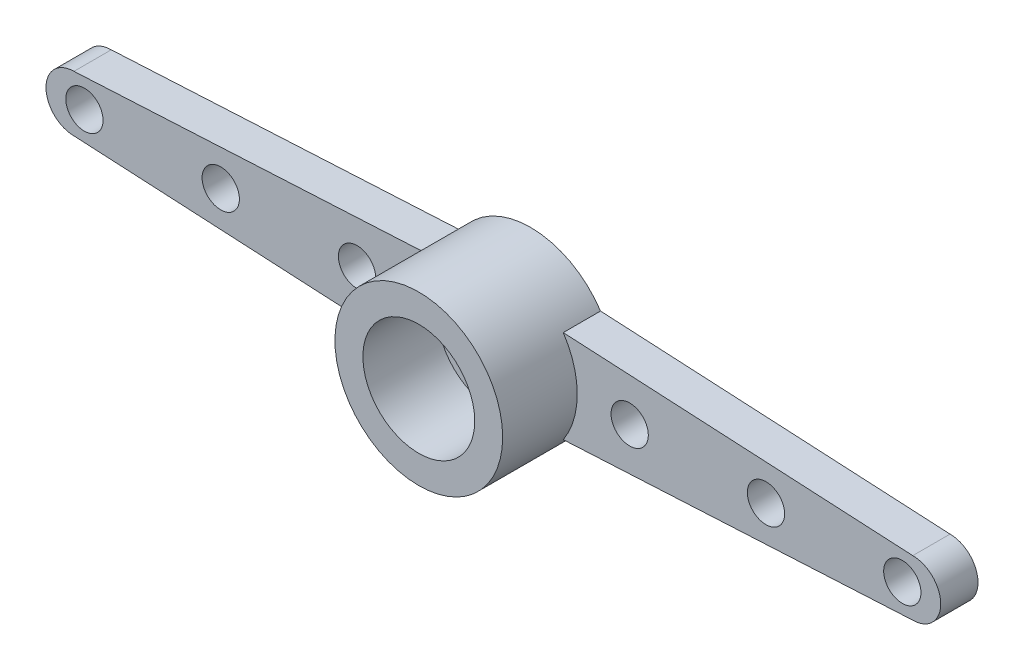
ISO-10303-21;
HEADER;
FILE_DESCRIPTION(('STEP AP214'),'2;1');
FILE_NAME('part.step','',(''),(''),'','','');
FILE_SCHEMA(('AUTOMOTIVE_DESIGN { 1 0 10303 214 1 1 1 1 }'));
ENDSEC;
DATA;
#1=APPLICATION_CONTEXT('core data for automotive mechanical design processes');
#2=APPLICATION_PROTOCOL_DEFINITION('international standard','automotive_design',2000,#1);
#3=PRODUCT_CONTEXT('',#1,'mechanical');
#4=PRODUCT('Part','Part','',(#3));
#5=PRODUCT_RELATED_PRODUCT_CATEGORY('part','',(#4));
#6=PRODUCT_DEFINITION_FORMATION('','',#4);
#7=PRODUCT_DEFINITION_CONTEXT('part definition',#1,'design');
#8=PRODUCT_DEFINITION('design','',#6,#7);
#9=PRODUCT_DEFINITION_SHAPE('','',#8);
#10=(LENGTH_UNIT() NAMED_UNIT(*) SI_UNIT(.MILLI.,.METRE.));
#11=(NAMED_UNIT(*) PLANE_ANGLE_UNIT() SI_UNIT($,.RADIAN.));
#12=(NAMED_UNIT(*) SI_UNIT($,.STERADIAN.) SOLID_ANGLE_UNIT());
#13=UNCERTAINTY_MEASURE_WITH_UNIT(LENGTH_MEASURE(1.E-05),#10,'distance_accuracy_value','');
#14=(GEOMETRIC_REPRESENTATION_CONTEXT(3) GLOBAL_UNCERTAINTY_ASSIGNED_CONTEXT((#13)) GLOBAL_UNIT_ASSIGNED_CONTEXT((#10,
#11,#12)) REPRESENTATION_CONTEXT('',''));
#15=CARTESIAN_POINT('',(0.,0.,0.));
#16=DIRECTION('',(0.,0.,1.));
#17=DIRECTION('',(1.,0.,0.));
#18=AXIS2_PLACEMENT_3D('',#15,#16,#17);
#19=CARTESIAN_POINT('',(-22.5,0.,6.));
#20=DIRECTION('',(0.,0.,-1.));
#21=DIRECTION('',(-1.,0.,0.));
#22=AXIS2_PLACEMENT_3D('',#19,#20,#21);
#23=CYLINDRICAL_SURFACE('',#22,1.5);
#24=CARTESIAN_POINT('',(-22.5,0.,2.));
#25=DIRECTION('',(0.,0.,1.));
#26=DIRECTION('',(1.,0.,0.));
#27=AXIS2_PLACEMENT_3D('',#24,#25,#26);
#28=CIRCLE('',#27,1.5);
#29=CARTESIAN_POINT('',(-22.5,1.5,2.));
#30=VERTEX_POINT('',#29);
#31=CARTESIAN_POINT('',(-22.5,-1.5,2.));
#32=VERTEX_POINT('',#31);
#33=EDGE_CURVE('E115',#30,#32,#28,.T.);
#34=ORIENTED_EDGE('',*,*,#33,.F.);
#35=DIRECTION('',(0.,0.,-1.));
#36=VECTOR('',#35,1.);
#37=CARTESIAN_POINT('',(-22.5,1.5,6.));
#38=LINE('',#37,#36);
#39=CARTESIAN_POINT('',(-22.5,1.5,0.));
#40=VERTEX_POINT('',#39);
#41=EDGE_CURVE('E53',#30,#40,#38,.T.);
#42=ORIENTED_EDGE('',*,*,#41,.T.);
#43=CARTESIAN_POINT('',(-22.5,0.,0.));
#44=DIRECTION('',(0.,0.,1.));
#45=DIRECTION('',(1.,0.,0.));
#46=AXIS2_PLACEMENT_3D('',#43,#44,#45);
#47=CIRCLE('',#46,1.5);
#48=CARTESIAN_POINT('',(-22.5,-1.5,0.));
#49=VERTEX_POINT('',#48);
#50=EDGE_CURVE('E173',#40,#49,#47,.T.);
#51=ORIENTED_EDGE('',*,*,#50,.T.);
#52=DIRECTION('',(0.,0.,-1.));
#53=VECTOR('',#52,1.);
#54=CARTESIAN_POINT('',(-22.5,-1.5,6.));
#55=LINE('',#54,#53);
#56=EDGE_CURVE('E11',#32,#49,#55,.T.);
#57=ORIENTED_EDGE('',*,*,#56,.F.);
#58=EDGE_LOOP('',(#34,#42,#51,#57));
#59=FACE_BOUND('',#58,.T.);
#60=ADVANCED_FACE('F37',(#59),#23,.T.);
#61=CARTESIAN_POINT('',(-0.141012405413293,-2.67753589417127,6.));
#62=DIRECTION('',(0.0525921073474452,0.998616077501637,0.));
#63=DIRECTION('',(-0.998616077501637,0.0525921073474452,0.));
#64=AXIS2_PLACEMENT_3D('',#61,#62,#63);
#65=PLANE('',#64);
#66=DIRECTION('',(0.998616077501637,-0.0525921073474452,0.));
#67=VECTOR('',#66,1.);
#68=CARTESIAN_POINT('',(-0.141012405413293,-2.67753589417127,2.));
#69=LINE('',#68,#67);
#70=CARTESIAN_POINT('',(-3.75,-2.48746859276655,2.));
#71=VERTEX_POINT('',#70);
#72=EDGE_CURVE('E109',#32,#71,#69,.T.);
#73=ORIENTED_EDGE('',*,*,#72,.F.);
#74=ORIENTED_EDGE('',*,*,#56,.T.);
#75=DIRECTION('',(0.998616077501637,-0.0525921073474452,0.));
#76=VECTOR('',#75,1.);
#77=CARTESIAN_POINT('',(-0.141012405413293,-2.67753589417127,0.));
#78=LINE('',#77,#76);
#79=CARTESIAN_POINT('',(-3.75000000000001,-2.48746859276655,0.));
#80=VERTEX_POINT('',#79);
#81=EDGE_CURVE('E191',#49,#80,#78,.T.);
#82=ORIENTED_EDGE('',*,*,#81,.T.);
#83=DIRECTION('',(0.,0.,-1.));
#84=VECTOR('',#83,1.);
#85=CARTESIAN_POINT('',(-3.75000000000001,-2.48746859276655,6.));
#86=LINE('',#85,#84);
#87=EDGE_CURVE('E45',#71,#80,#86,.T.);
#88=ORIENTED_EDGE('',*,*,#87,.F.);
#89=EDGE_LOOP('',(#73,#74,#82,#88));
#90=FACE_BOUND('',#89,.T.);
#91=ADVANCED_FACE('F212',(#90),#65,.F.);
#92=CARTESIAN_POINT('',(0.141012405413293,-2.67753589417127,6.));
#93=DIRECTION('',(0.0525921073474452,-0.998616077501637,0.));
#94=DIRECTION('',(0.998616077501637,0.0525921073474452,0.));
#95=AXIS2_PLACEMENT_3D('',#92,#93,#94);
#96=PLANE('',#95);
#97=DIRECTION('',(0.,0.,-1.));
#98=VECTOR('',#97,1.);
#99=CARTESIAN_POINT('',(22.5,-1.5,6.));
#100=LINE('',#99,#98);
#101=CARTESIAN_POINT('',(22.5,-1.5,2.));
#102=VERTEX_POINT('',#101);
#103=CARTESIAN_POINT('',(22.5,-1.5,0.));
#104=VERTEX_POINT('',#103);
#105=EDGE_CURVE('E131',#102,#104,#100,.T.);
#106=ORIENTED_EDGE('',*,*,#105,.F.);
#107=DIRECTION('',(0.998616077501637,0.0525921073474452,0.));
#108=VECTOR('',#107,1.);
#109=CARTESIAN_POINT('',(0.141012405413293,-2.67753589417127,2.));
#110=LINE('',#109,#108);
#111=CARTESIAN_POINT('',(3.74999999999999,-2.48746859276655,2.));
#112=VERTEX_POINT('',#111);
#113=EDGE_CURVE('E176',#112,#102,#110,.T.);
#114=ORIENTED_EDGE('',*,*,#113,.F.);
#115=DIRECTION('',(0.,0.,-1.));
#116=VECTOR('',#115,1.);
#117=CARTESIAN_POINT('',(3.74999999999999,-2.48746859276656,6.));
#118=LINE('',#117,#116);
#119=CARTESIAN_POINT('',(3.74999999999999,-2.48746859276656,0.));
#120=VERTEX_POINT('',#119);
#121=EDGE_CURVE('E133',#112,#120,#118,.T.);
#122=ORIENTED_EDGE('',*,*,#121,.T.);
#123=DIRECTION('',(-0.998616077501637,-0.0525921073474452,0.));
#124=VECTOR('',#123,1.);
#125=CARTESIAN_POINT('',(0.141012405413293,-2.67753589417127,0.));
#126=LINE('',#125,#124);
#127=EDGE_CURVE('E197',#104,#120,#126,.T.);
#128=ORIENTED_EDGE('',*,*,#127,.F.);
#129=EDGE_LOOP('',(#106,#114,#122,#128));
#130=FACE_BOUND('',#129,.T.);
#131=ADVANCED_FACE('F218',(#130),#96,.T.);
#132=CARTESIAN_POINT('',(22.5,0.,6.));
#133=DIRECTION('',(0.,0.,-1.));
#134=DIRECTION('',(-1.,0.,0.));
#135=AXIS2_PLACEMENT_3D('',#132,#133,#134);
#136=CYLINDRICAL_SURFACE('',#135,1.5);
#137=CARTESIAN_POINT('',(22.5,0.,2.));
#138=DIRECTION('',(0.,0.,1.));
#139=DIRECTION('',(1.,0.,0.));
#140=AXIS2_PLACEMENT_3D('',#137,#138,#139);
#141=CIRCLE('',#140,1.5);
#142=CARTESIAN_POINT('',(22.5,1.5,2.));
#143=VERTEX_POINT('',#142);
#144=EDGE_CURVE('E179',#102,#143,#141,.T.);
#145=ORIENTED_EDGE('',*,*,#144,.F.);
#146=ORIENTED_EDGE('',*,*,#105,.T.);
#147=CARTESIAN_POINT('',(22.5,0.,0.));
#148=DIRECTION('',(0.,0.,1.));
#149=DIRECTION('',(1.,0.,0.));
#150=AXIS2_PLACEMENT_3D('',#147,#148,#149);
#151=CIRCLE('',#150,1.5);
#152=CARTESIAN_POINT('',(22.5,1.5,0.));
#153=VERTEX_POINT('',#152);
#154=EDGE_CURVE('E200',#104,#153,#151,.T.);
#155=ORIENTED_EDGE('',*,*,#154,.T.);
#156=DIRECTION('',(0.,0.,-1.));
#157=VECTOR('',#156,1.);
#158=CARTESIAN_POINT('',(22.5,1.5,6.));
#159=LINE('',#158,#157);
#160=EDGE_CURVE('E124',#143,#153,#159,.T.);
#161=ORIENTED_EDGE('',*,*,#160,.F.);
#162=EDGE_LOOP('',(#145,#146,#155,#161));
#163=FACE_BOUND('',#162,.T.);
#164=ADVANCED_FACE('F226',(#163),#136,.T.);
#165=CARTESIAN_POINT('',(0.141012405413293,2.67753589417127,6.));
#166=DIRECTION('',(-0.0525921073474452,-0.998616077501637,0.));
#167=DIRECTION('',(0.998616077501637,-0.0525921073474452,0.));
#168=AXIS2_PLACEMENT_3D('',#165,#166,#167);
#169=PLANE('',#168);
#170=DIRECTION('',(-0.998616077501637,0.0525921073474452,0.));
#171=VECTOR('',#170,1.);
#172=CARTESIAN_POINT('',(0.141012405413293,2.67753589417127,2.));
#173=LINE('',#172,#171);
#174=CARTESIAN_POINT('',(3.75,2.48746859276655,2.));
#175=VERTEX_POINT('',#174);
#176=EDGE_CURVE('E112',#143,#175,#173,.T.);
#177=ORIENTED_EDGE('',*,*,#176,.F.);
#178=ORIENTED_EDGE('',*,*,#160,.T.);
#179=DIRECTION('',(-0.998616077501637,0.0525921073474452,0.));
#180=VECTOR('',#179,1.);
#181=CARTESIAN_POINT('',(0.141012405413293,2.67753589417127,0.));
#182=LINE('',#181,#180);
#183=CARTESIAN_POINT('',(3.75,2.48746859276655,0.));
#184=VERTEX_POINT('',#183);
#185=EDGE_CURVE('E203',#153,#184,#182,.T.);
#186=ORIENTED_EDGE('',*,*,#185,.T.);
#187=DIRECTION('',(0.,0.,-1.));
#188=VECTOR('',#187,1.);
#189=CARTESIAN_POINT('',(3.75,2.48746859276655,6.));
#190=LINE('',#189,#188);
#191=EDGE_CURVE('E122',#175,#184,#190,.T.);
#192=ORIENTED_EDGE('',*,*,#191,.F.);
#193=EDGE_LOOP('',(#177,#178,#186,#192));
#194=FACE_BOUND('',#193,.T.);
#195=ADVANCED_FACE('F228',(#194),#169,.F.);
#196=CARTESIAN_POINT('',(-0.141012405413293,2.67753589417127,6.));
#197=DIRECTION('',(-0.0525921073474452,0.998616077501637,0.));
#198=DIRECTION('',(-0.998616077501637,-0.0525921073474452,0.));
#199=AXIS2_PLACEMENT_3D('',#196,#197,#198);
#200=PLANE('',#199);
#201=ORIENTED_EDGE('',*,*,#41,.F.);
#202=DIRECTION('',(-0.998616077501637,-0.0525921073474452,0.));
#203=VECTOR('',#202,1.);
#204=CARTESIAN_POINT('',(-0.141012405413293,2.67753589417127,2.));
#205=LINE('',#204,#203);
#206=CARTESIAN_POINT('',(-3.75,2.48746859276655,2.));
#207=VERTEX_POINT('',#206);
#208=EDGE_CURVE('E107',#207,#30,#205,.T.);
#209=ORIENTED_EDGE('',*,*,#208,.F.);
#210=DIRECTION('',(0.,0.,-1.));
#211=VECTOR('',#210,1.);
#212=CARTESIAN_POINT('',(-3.75,2.48746859276656,6.));
#213=LINE('',#212,#211);
#214=CARTESIAN_POINT('',(-3.75,2.48746859276656,0.));
#215=VERTEX_POINT('',#214);
#216=EDGE_CURVE('E61',#207,#215,#213,.T.);
#217=ORIENTED_EDGE('',*,*,#216,.T.);
#218=DIRECTION('',(0.998616077501637,0.0525921073474452,0.));
#219=VECTOR('',#218,1.);
#220=CARTESIAN_POINT('',(-0.141012405413293,2.67753589417127,0.));
#221=LINE('',#220,#219);
#222=EDGE_CURVE('E189',#40,#215,#221,.T.);
#223=ORIENTED_EDGE('',*,*,#222,.F.);
#224=EDGE_LOOP('',(#201,#209,#217,#223));
#225=FACE_BOUND('',#224,.T.);
#226=ADVANCED_FACE('F114',(#225),#200,.T.);
#227=CARTESIAN_POINT('',(0.,0.,6.));
#228=DIRECTION('',(0.,0.,1.));
#229=DIRECTION('',(1.,0.,0.));
#230=AXIS2_PLACEMENT_3D('',#227,#228,#229);
#231=PLANE('',#230);
#232=CARTESIAN_POINT('',(0.,0.,6.));
#233=DIRECTION('',(0.,0.,1.));
#234=DIRECTION('',(1.,0.,0.));
#235=AXIS2_PLACEMENT_3D('',#232,#233,#234);
#236=CIRCLE('',#235,3.);
#237=CARTESIAN_POINT('',(3.,0.,6.));
#238=VERTEX_POINT('',#237);
#239=EDGE_CURVE('E149',#238,#238,#236,.T.);
#240=ORIENTED_EDGE('',*,*,#239,.F.);
#241=EDGE_LOOP('',(#240));
#242=FACE_BOUND('',#241,.T.);
#243=CARTESIAN_POINT('',(0.,0.,6.));
#244=DIRECTION('',(0.,0.,1.));
#245=DIRECTION('',(1.,0.,0.));
#246=AXIS2_PLACEMENT_3D('',#243,#244,#245);
#247=CIRCLE('',#246,4.5);
#248=CARTESIAN_POINT('',(4.5,0.,6.));
#249=VERTEX_POINT('',#248);
#250=EDGE_CURVE('E126',#249,#249,#247,.T.);
#251=ORIENTED_EDGE('',*,*,#250,.T.);
#252=EDGE_LOOP('',(#251));
#253=FACE_BOUND('',#252,.T.);
#254=ADVANCED_FACE('F236',(#242,#253),#231,.T.);
#255=CARTESIAN_POINT('',(0.,0.,6.));
#256=DIRECTION('',(0.,0.,-1.));
#257=DIRECTION('',(-1.,0.,0.));
#258=AXIS2_PLACEMENT_3D('',#255,#256,#257);
#259=CYLINDRICAL_SURFACE('',#258,4.5);
#260=CARTESIAN_POINT('',(0.,0.,2.));
#261=DIRECTION('',(0.,0.,1.));
#262=DIRECTION('',(1.,0.,0.));
#263=AXIS2_PLACEMENT_3D('',#260,#261,#262);
#264=CIRCLE('',#263,4.5);
#265=EDGE_CURVE('E105',#207,#71,#264,.T.);
#266=ORIENTED_EDGE('',*,*,#265,.T.);
#267=ORIENTED_EDGE('',*,*,#87,.T.);
#268=CARTESIAN_POINT('',(0.,0.,0.));
#269=DIRECTION('',(0.,0.,1.));
#270=DIRECTION('',(1.,0.,0.));
#271=AXIS2_PLACEMENT_3D('',#268,#269,#270);
#272=CIRCLE('',#271,4.5);
#273=EDGE_CURVE('E194',#80,#120,#272,.T.);
#274=ORIENTED_EDGE('',*,*,#273,.T.);
#275=ORIENTED_EDGE('',*,*,#121,.F.);
#276=CARTESIAN_POINT('',(0.,0.,2.));
#277=DIRECTION('',(0.,0.,1.));
#278=DIRECTION('',(1.,0.,0.));
#279=AXIS2_PLACEMENT_3D('',#276,#277,#278);
#280=CIRCLE('',#279,4.5);
#281=EDGE_CURVE('E174',#112,#175,#280,.T.);
#282=ORIENTED_EDGE('',*,*,#281,.T.);
#283=ORIENTED_EDGE('',*,*,#191,.T.);
#284=EDGE_CURVE('E120',#184,#215,#272,.T.);
#285=ORIENTED_EDGE('',*,*,#284,.T.);
#286=ORIENTED_EDGE('',*,*,#216,.F.);
#287=EDGE_LOOP('',(#266,#267,#274,#275,#282,#283,#285,#286));
#288=FACE_BOUND('',#287,.T.);
#289=ORIENTED_EDGE('',*,*,#250,.F.);
#290=EDGE_LOOP('',(#289));
#291=FACE_BOUND('',#290,.T.);
#292=ADVANCED_FACE('F117',(#288,#291),#259,.T.);
#293=CARTESIAN_POINT('',(0.,0.,0.));
#294=DIRECTION('',(0.,0.,1.));
#295=DIRECTION('',(1.,0.,0.));
#296=AXIS2_PLACEMENT_3D('',#293,#294,#295);
#297=PLANE('',#296);
#298=CARTESIAN_POINT('',(7.31290224841313,0.,0.));
#299=DIRECTION('',(0.,0.,1.));
#300=DIRECTION('',(1.,0.,0.));
#301=AXIS2_PLACEMENT_3D('',#298,#299,#300);
#302=CIRCLE('',#301,1.);
#303=CARTESIAN_POINT('',(8.31290224841313,0.,0.));
#304=VERTEX_POINT('',#303);
#305=EDGE_CURVE('E153',#304,#304,#302,.T.);
#306=ORIENTED_EDGE('',*,*,#305,.T.);
#307=EDGE_LOOP('',(#306));
#308=FACE_BOUND('',#307,.T.);
#309=CARTESIAN_POINT('',(14.6258044968263,0.,0.));
#310=DIRECTION('',(0.,0.,1.));
#311=DIRECTION('',(1.,0.,0.));
#312=AXIS2_PLACEMENT_3D('',#309,#310,#311);
#313=CIRCLE('',#312,1.);
#314=CARTESIAN_POINT('',(15.6258044968263,0.,0.));
#315=VERTEX_POINT('',#314);
#316=EDGE_CURVE('E407',#315,#315,#313,.T.);
#317=ORIENTED_EDGE('',*,*,#316,.T.);
#318=EDGE_LOOP('',(#317));
#319=FACE_BOUND('',#318,.T.);
#320=CARTESIAN_POINT('',(21.9387067452394,0.,0.));
#321=DIRECTION('',(0.,0.,1.));
#322=DIRECTION('',(1.,0.,0.));
#323=AXIS2_PLACEMENT_3D('',#320,#321,#322);
#324=CIRCLE('',#323,1.);
#325=CARTESIAN_POINT('',(22.9387067452394,0.,0.));
#326=VERTEX_POINT('',#325);
#327=EDGE_CURVE('E410',#326,#326,#324,.T.);
#328=ORIENTED_EDGE('',*,*,#327,.T.);
#329=EDGE_LOOP('',(#328));
#330=FACE_BOUND('',#329,.T.);
#331=CARTESIAN_POINT('',(0.,0.,0.));
#332=DIRECTION('',(0.,0.,-1.));
#333=DIRECTION('',(-1.,0.,0.));
#334=AXIS2_PLACEMENT_3D('',#331,#332,#333);
#335=CIRCLE('',#334,1.);
#336=CARTESIAN_POINT('',(-1.,0.,0.));
#337=VERTEX_POINT('',#336);
#338=EDGE_CURVE('E140',#337,#337,#335,.T.);
#339=ORIENTED_EDGE('',*,*,#338,.F.);
#340=EDGE_LOOP('',(#339));
#341=FACE_BOUND('',#340,.T.);
#342=CARTESIAN_POINT('',(-7.31290224841313,0.,0.));
#343=DIRECTION('',(0.,0.,-1.));
#344=DIRECTION('',(-1.,0.,0.));
#345=AXIS2_PLACEMENT_3D('',#342,#343,#344);
#346=CIRCLE('',#345,1.);
#347=CARTESIAN_POINT('',(-8.31290224841313,0.,0.));
#348=VERTEX_POINT('',#347);
#349=EDGE_CURVE('E167',#348,#348,#346,.T.);
#350=ORIENTED_EDGE('',*,*,#349,.F.);
#351=EDGE_LOOP('',(#350));
#352=FACE_BOUND('',#351,.T.);
#353=CARTESIAN_POINT('',(-14.6258044968263,0.,0.));
#354=DIRECTION('',(0.,0.,-1.));
#355=DIRECTION('',(-1.,0.,0.));
#356=AXIS2_PLACEMENT_3D('',#353,#354,#355);
#357=CIRCLE('',#356,1.);
#358=CARTESIAN_POINT('',(-15.6258044968263,0.,0.));
#359=VERTEX_POINT('',#358);
#360=EDGE_CURVE('E162',#359,#359,#357,.T.);
#361=ORIENTED_EDGE('',*,*,#360,.F.);
#362=EDGE_LOOP('',(#361));
#363=FACE_BOUND('',#362,.T.);
#364=CARTESIAN_POINT('',(-21.9387067452394,0.,0.));
#365=DIRECTION('',(0.,0.,-1.));
#366=DIRECTION('',(-1.,0.,0.));
#367=AXIS2_PLACEMENT_3D('',#364,#365,#366);
#368=CIRCLE('',#367,1.);
#369=CARTESIAN_POINT('',(-22.9387067452394,0.,0.));
#370=VERTEX_POINT('',#369);
#371=EDGE_CURVE('E158',#370,#370,#368,.T.);
#372=ORIENTED_EDGE('',*,*,#371,.F.);
#373=EDGE_LOOP('',(#372));
#374=FACE_BOUND('',#373,.T.);
#375=ORIENTED_EDGE('',*,*,#50,.F.);
#376=ORIENTED_EDGE('',*,*,#222,.T.);
#377=ORIENTED_EDGE('',*,*,#284,.F.);
#378=ORIENTED_EDGE('',*,*,#185,.F.);
#379=ORIENTED_EDGE('',*,*,#154,.F.);
#380=ORIENTED_EDGE('',*,*,#127,.T.);
#381=ORIENTED_EDGE('',*,*,#273,.F.);
#382=ORIENTED_EDGE('',*,*,#81,.F.);
#383=EDGE_LOOP('',(#375,#376,#377,#378,#379,#380,#381,#382));
#384=FACE_BOUND('',#383,.T.);
#385=ADVANCED_FACE('F206',(#308,#319,#330,#341,#352,#363,#374,#384),#297,.F.);
#386=CARTESIAN_POINT('',(0.,0.,2.));
#387=DIRECTION('',(0.,0.,1.));
#388=DIRECTION('',(1.,0.,0.));
#389=AXIS2_PLACEMENT_3D('',#386,#387,#388);
#390=CYLINDRICAL_SURFACE('',#389,3.);
#391=CARTESIAN_POINT('',(0.,0.,2.));
#392=DIRECTION('',(0.,0.,1.));
#393=DIRECTION('',(1.,0.,0.));
#394=AXIS2_PLACEMENT_3D('',#391,#392,#393);
#395=CIRCLE('',#394,3.);
#396=CARTESIAN_POINT('',(3.,0.,2.));
#397=VERTEX_POINT('',#396);
#398=EDGE_CURVE('E177',#397,#397,#395,.T.);
#399=ORIENTED_EDGE('',*,*,#398,.F.);
#400=EDGE_LOOP('',(#399));
#401=FACE_BOUND('',#400,.T.);
#402=ORIENTED_EDGE('',*,*,#239,.T.);
#403=EDGE_LOOP('',(#402));
#404=FACE_BOUND('',#403,.T.);
#405=ADVANCED_FACE('F289',(#401,#404),#390,.F.);
#406=CARTESIAN_POINT('',(0.,0.,2.));
#407=DIRECTION('',(0.,0.,1.));
#408=DIRECTION('',(1.,0.,0.));
#409=AXIS2_PLACEMENT_3D('',#406,#407,#408);
#410=PLANE('',#409);
#411=CARTESIAN_POINT('',(0.,0.,2.));
#412=DIRECTION('',(0.,0.,1.));
#413=DIRECTION('',(1.,0.,0.));
#414=AXIS2_PLACEMENT_3D('',#411,#412,#413);
#415=CIRCLE('',#414,1.);
#416=CARTESIAN_POINT('',(1.,0.,2.));
#417=VERTEX_POINT('',#416);
#418=EDGE_CURVE('E146',#417,#417,#415,.T.);
#419=ORIENTED_EDGE('',*,*,#418,.F.);
#420=EDGE_LOOP('',(#419));
#421=FACE_BOUND('',#420,.T.);
#422=ORIENTED_EDGE('',*,*,#398,.T.);
#423=EDGE_LOOP('',(#422));
#424=FACE_BOUND('',#423,.T.);
#425=ADVANCED_FACE('F293',(#421,#424),#410,.T.);
#426=CARTESIAN_POINT('',(0.,0.,2.));
#427=DIRECTION('',(0.,0.,1.));
#428=DIRECTION('',(1.,0.,0.));
#429=AXIS2_PLACEMENT_3D('',#426,#427,#428);
#430=PLANE('',#429);
#431=CARTESIAN_POINT('',(7.31290224841313,0.,2.));
#432=DIRECTION('',(0.,0.,1.));
#433=DIRECTION('',(1.,0.,0.));
#434=AXIS2_PLACEMENT_3D('',#431,#432,#433);
#435=CIRCLE('',#434,1.);
#436=CARTESIAN_POINT('',(8.31290224841313,0.,2.));
#437=VERTEX_POINT('',#436);
#438=EDGE_CURVE('E40',#437,#437,#435,.F.);
#439=ORIENTED_EDGE('',*,*,#438,.T.);
#440=EDGE_LOOP('',(#439));
#441=FACE_BOUND('',#440,.T.);
#442=CARTESIAN_POINT('',(14.6258044968263,0.,2.));
#443=DIRECTION('',(0.,0.,1.));
#444=DIRECTION('',(1.,0.,0.));
#445=AXIS2_PLACEMENT_3D('',#442,#443,#444);
#446=CIRCLE('',#445,1.);
#447=CARTESIAN_POINT('',(15.6258044968263,0.,2.));
#448=VERTEX_POINT('',#447);
#449=EDGE_CURVE('E152',#448,#448,#446,.F.);
#450=ORIENTED_EDGE('',*,*,#449,.T.);
#451=EDGE_LOOP('',(#450));
#452=FACE_BOUND('',#451,.T.);
#453=CARTESIAN_POINT('',(21.9387067452394,0.,2.));
#454=DIRECTION('',(0.,0.,1.));
#455=DIRECTION('',(1.,0.,0.));
#456=AXIS2_PLACEMENT_3D('',#453,#454,#455);
#457=CIRCLE('',#456,1.);
#458=CARTESIAN_POINT('',(22.9387067452394,0.,2.));
#459=VERTEX_POINT('',#458);
#460=EDGE_CURVE('E150',#459,#459,#457,.F.);
#461=ORIENTED_EDGE('',*,*,#460,.T.);
#462=EDGE_LOOP('',(#461));
#463=FACE_BOUND('',#462,.T.);
#464=ORIENTED_EDGE('',*,*,#281,.F.);
#465=ORIENTED_EDGE('',*,*,#113,.T.);
#466=ORIENTED_EDGE('',*,*,#144,.T.);
#467=ORIENTED_EDGE('',*,*,#176,.T.);
#468=EDGE_LOOP('',(#464,#465,#466,#467));
#469=FACE_BOUND('',#468,.T.);
#470=ADVANCED_FACE('F222',(#441,#452,#463,#469),#430,.T.);
#471=CARTESIAN_POINT('',(0.,0.,2.));
#472=DIRECTION('',(0.,0.,1.));
#473=DIRECTION('',(1.,0.,0.));
#474=AXIS2_PLACEMENT_3D('',#471,#472,#473);
#475=PLANE('',#474);
#476=CARTESIAN_POINT('',(-7.31290224841313,0.,2.));
#477=DIRECTION('',(0.,0.,1.));
#478=DIRECTION('',(1.,0.,0.));
#479=AXIS2_PLACEMENT_3D('',#476,#477,#478);
#480=CIRCLE('',#479,1.);
#481=CARTESIAN_POINT('',(-6.31290224841313,0.,2.));
#482=VERTEX_POINT('',#481);
#483=EDGE_CURVE('E143',#482,#482,#480,.T.);
#484=ORIENTED_EDGE('',*,*,#483,.F.);
#485=EDGE_LOOP('',(#484));
#486=FACE_BOUND('',#485,.T.);
#487=CARTESIAN_POINT('',(-14.6258044968263,0.,2.));
#488=DIRECTION('',(0.,0.,1.));
#489=DIRECTION('',(1.,0.,0.));
#490=AXIS2_PLACEMENT_3D('',#487,#488,#489);
#491=CIRCLE('',#490,1.);
#492=CARTESIAN_POINT('',(-13.6258044968263,0.,2.));
#493=VERTEX_POINT('',#492);
#494=EDGE_CURVE('E139',#493,#493,#491,.T.);
#495=ORIENTED_EDGE('',*,*,#494,.F.);
#496=EDGE_LOOP('',(#495));
#497=FACE_BOUND('',#496,.T.);
#498=CARTESIAN_POINT('',(-21.9387067452394,0.,2.));
#499=DIRECTION('',(0.,0.,1.));
#500=DIRECTION('',(1.,0.,0.));
#501=AXIS2_PLACEMENT_3D('',#498,#499,#500);
#502=CIRCLE('',#501,1.);
#503=CARTESIAN_POINT('',(-20.9387067452394,0.,2.));
#504=VERTEX_POINT('',#503);
#505=EDGE_CURVE('E136',#504,#504,#502,.T.);
#506=ORIENTED_EDGE('',*,*,#505,.F.);
#507=EDGE_LOOP('',(#506));
#508=FACE_BOUND('',#507,.T.);
#509=ORIENTED_EDGE('',*,*,#265,.F.);
#510=ORIENTED_EDGE('',*,*,#208,.T.);
#511=ORIENTED_EDGE('',*,*,#33,.T.);
#512=ORIENTED_EDGE('',*,*,#72,.T.);
#513=EDGE_LOOP('',(#509,#510,#511,#512));
#514=FACE_BOUND('',#513,.T.);
#515=ADVANCED_FACE('F106',(#486,#497,#508,#514),#475,.T.);
#516=CARTESIAN_POINT('',(-21.9387067452394,0.,10.));
#517=DIRECTION('',(0.,0.,-1.));
#518=DIRECTION('',(-1.,0.,0.));
#519=AXIS2_PLACEMENT_3D('',#516,#517,#518);
#520=CYLINDRICAL_SURFACE('',#519,1.);
#521=ORIENTED_EDGE('',*,*,#505,.T.);
#522=EDGE_LOOP('',(#521));
#523=FACE_BOUND('',#522,.T.);
#524=ORIENTED_EDGE('',*,*,#371,.T.);
#525=EDGE_LOOP('',(#524));
#526=FACE_BOUND('',#525,.T.);
#527=ADVANCED_FACE('F314',(#523,#526),#520,.F.);
#528=CARTESIAN_POINT('',(-14.6258044968263,0.,10.));
#529=DIRECTION('',(0.,0.,-1.));
#530=DIRECTION('',(-1.,0.,0.));
#531=AXIS2_PLACEMENT_3D('',#528,#529,#530);
#532=CYLINDRICAL_SURFACE('',#531,1.);
#533=ORIENTED_EDGE('',*,*,#494,.T.);
#534=EDGE_LOOP('',(#533));
#535=FACE_BOUND('',#534,.T.);
#536=ORIENTED_EDGE('',*,*,#360,.T.);
#537=EDGE_LOOP('',(#536));
#538=FACE_BOUND('',#537,.T.);
#539=ADVANCED_FACE('F324',(#535,#538),#532,.F.);
#540=CARTESIAN_POINT('',(-7.31290224841313,0.,10.));
#541=DIRECTION('',(0.,0.,-1.));
#542=DIRECTION('',(-1.,0.,0.));
#543=AXIS2_PLACEMENT_3D('',#540,#541,#542);
#544=CYLINDRICAL_SURFACE('',#543,1.);
#545=ORIENTED_EDGE('',*,*,#483,.T.);
#546=EDGE_LOOP('',(#545));
#547=FACE_BOUND('',#546,.T.);
#548=ORIENTED_EDGE('',*,*,#349,.T.);
#549=EDGE_LOOP('',(#548));
#550=FACE_BOUND('',#549,.T.);
#551=ADVANCED_FACE('F334',(#547,#550),#544,.F.);
#552=CARTESIAN_POINT('',(0.,0.,10.));
#553=DIRECTION('',(0.,0.,-1.));
#554=DIRECTION('',(-1.,0.,0.));
#555=AXIS2_PLACEMENT_3D('',#552,#553,#554);
#556=CYLINDRICAL_SURFACE('',#555,1.);
#557=ORIENTED_EDGE('',*,*,#418,.T.);
#558=EDGE_LOOP('',(#557));
#559=FACE_BOUND('',#558,.T.);
#560=ORIENTED_EDGE('',*,*,#338,.T.);
#561=EDGE_LOOP('',(#560));
#562=FACE_BOUND('',#561,.T.);
#563=ADVANCED_FACE('F344',(#559,#562),#556,.F.);
#564=CARTESIAN_POINT('',(21.9387067452394,0.,10.));
#565=DIRECTION('',(0.,0.,-1.));
#566=DIRECTION('',(-1.,0.,0.));
#567=AXIS2_PLACEMENT_3D('',#564,#565,#566);
#568=CYLINDRICAL_SURFACE('',#567,1.);
#569=ORIENTED_EDGE('',*,*,#460,.F.);
#570=EDGE_LOOP('',(#569));
#571=FACE_BOUND('',#570,.T.);
#572=ORIENTED_EDGE('',*,*,#327,.F.);
#573=EDGE_LOOP('',(#572));
#574=FACE_BOUND('',#573,.T.);
#575=ADVANCED_FACE('F354',(#571,#574),#568,.F.);
#576=CARTESIAN_POINT('',(14.6258044968263,0.,10.));
#577=DIRECTION('',(0.,0.,-1.));
#578=DIRECTION('',(-1.,0.,0.));
#579=AXIS2_PLACEMENT_3D('',#576,#577,#578);
#580=CYLINDRICAL_SURFACE('',#579,1.);
#581=ORIENTED_EDGE('',*,*,#449,.F.);
#582=EDGE_LOOP('',(#581));
#583=FACE_BOUND('',#582,.T.);
#584=ORIENTED_EDGE('',*,*,#316,.F.);
#585=EDGE_LOOP('',(#584));
#586=FACE_BOUND('',#585,.T.);
#587=ADVANCED_FACE('F380',(#583,#586),#580,.F.);
#588=CARTESIAN_POINT('',(7.31290224841313,0.,10.));
#589=DIRECTION('',(0.,0.,-1.));
#590=DIRECTION('',(-1.,0.,0.));
#591=AXIS2_PLACEMENT_3D('',#588,#589,#590);
#592=CYLINDRICAL_SURFACE('',#591,1.);
#593=ORIENTED_EDGE('',*,*,#438,.F.);
#594=EDGE_LOOP('',(#593));
#595=FACE_BOUND('',#594,.T.);
#596=ORIENTED_EDGE('',*,*,#305,.F.);
#597=EDGE_LOOP('',(#596));
#598=FACE_BOUND('',#597,.T.);
#599=ADVANCED_FACE('F390',(#595,#598),#592,.F.);
#600=CLOSED_SHELL('',(#60,#91,#131,#164,#195,#226,#254,#292,#385,#405,#425,#470,#515,#527,#539,
#551,#563,#575,#587,#599));
#601=MANIFOLD_SOLID_BREP('B2',#600);
#602=ADVANCED_BREP_SHAPE_REPRESENTATION('',(#18,#601),#14);
#603=SHAPE_DEFINITION_REPRESENTATION(#9,#602);
ENDSEC;
END-ISO-10303-21;
